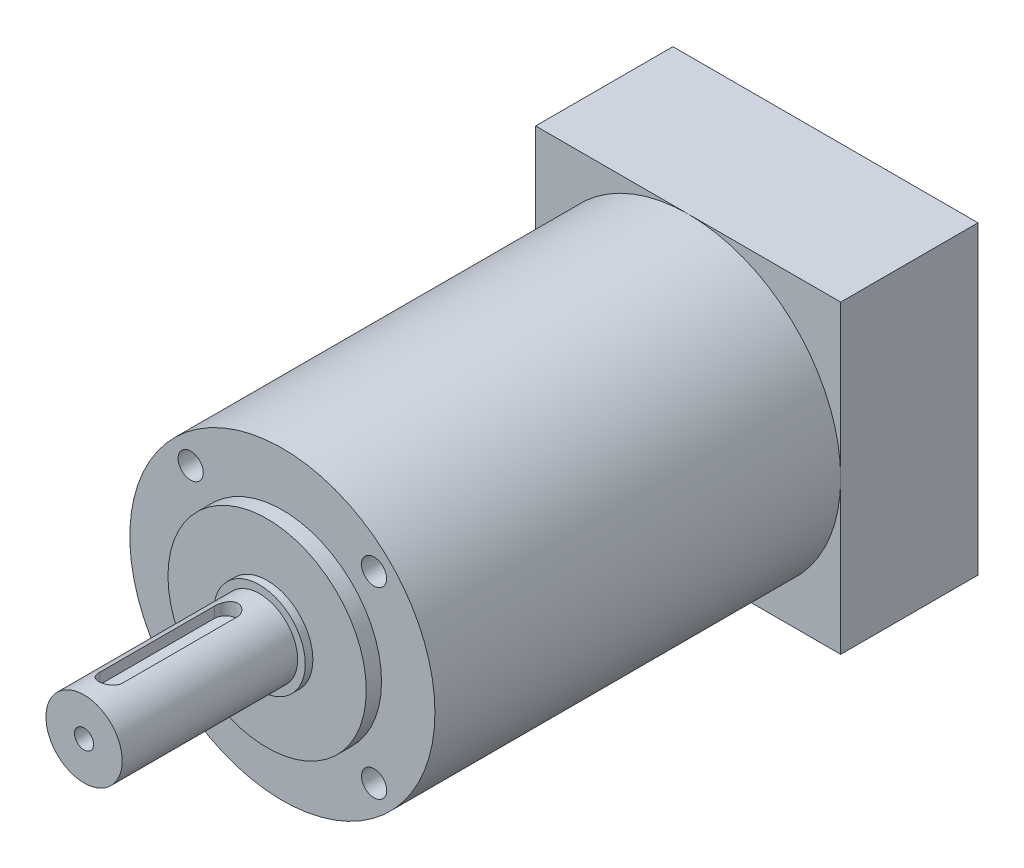
ISO-10303-21;
HEADER;
FILE_DESCRIPTION(('STEP AP214'),'2;1');
FILE_NAME('part.step','',(''),(''),'','','');
FILE_SCHEMA(('AUTOMOTIVE_DESIGN { 1 0 10303 214 1 1 1 1 }'));
ENDSEC;
DATA;
#1=APPLICATION_CONTEXT('core data for automotive mechanical design processes');
#2=APPLICATION_PROTOCOL_DEFINITION('international standard','automotive_design',2000,#1);
#3=PRODUCT_CONTEXT('',#1,'mechanical');
#4=PRODUCT('Part','Part','',(#3));
#5=PRODUCT_RELATED_PRODUCT_CATEGORY('part','',(#4));
#6=PRODUCT_DEFINITION_FORMATION('','',#4);
#7=PRODUCT_DEFINITION_CONTEXT('part definition',#1,'design');
#8=PRODUCT_DEFINITION('design','',#6,#7);
#9=PRODUCT_DEFINITION_SHAPE('','',#8);
#10=(LENGTH_UNIT() NAMED_UNIT(*) SI_UNIT(.MILLI.,.METRE.));
#11=(NAMED_UNIT(*) PLANE_ANGLE_UNIT() SI_UNIT($,.RADIAN.));
#12=(NAMED_UNIT(*) SI_UNIT($,.STERADIAN.) SOLID_ANGLE_UNIT());
#13=UNCERTAINTY_MEASURE_WITH_UNIT(LENGTH_MEASURE(1.E-05),#10,'distance_accuracy_value','');
#14=(GEOMETRIC_REPRESENTATION_CONTEXT(3) GLOBAL_UNCERTAINTY_ASSIGNED_CONTEXT((#13)) GLOBAL_UNIT_ASSIGNED_CONTEXT((#10,
#11,#12)) REPRESENTATION_CONTEXT('',''));
#15=CARTESIAN_POINT('',(0.,0.,0.));
#16=DIRECTION('',(0.,0.,1.));
#17=DIRECTION('',(1.,0.,0.));
#18=AXIS2_PLACEMENT_3D('',#15,#16,#17);
#19=CARTESIAN_POINT('',(20.,20.,97.2));
#20=DIRECTION('',(0.,0.,-1.));
#21=DIRECTION('',(-1.,0.,0.));
#22=AXIS2_PLACEMENT_3D('',#19,#20,#21);
#23=CYLINDRICAL_SURFACE('',#22,5.);
#24=CARTESIAN_POINT('',(20.,20.,97.2));
#25=DIRECTION('',(0.,0.,1.));
#26=DIRECTION('',(1.,0.,0.));
#27=AXIS2_PLACEMENT_3D('',#24,#25,#26);
#28=CIRCLE('',#27,5.);
#29=CARTESIAN_POINT('',(25.,20.,97.2));
#30=VERTEX_POINT('',#29);
#31=EDGE_CURVE('E213',#30,#30,#28,.T.);
#32=ORIENTED_EDGE('',*,*,#31,.F.);
#33=EDGE_LOOP('',(#32));
#34=FACE_BOUND('',#33,.T.);
#35=CARTESIAN_POINT('',(20.,20.,74.2));
#36=DIRECTION('',(0.,0.,1.));
#37=DIRECTION('',(1.,0.,0.));
#38=AXIS2_PLACEMENT_3D('',#35,#36,#37);
#39=CIRCLE('',#38,5.);
#40=CARTESIAN_POINT('',(25.,20.,74.2));
#41=VERTEX_POINT('',#40);
#42=EDGE_CURVE('E218',#41,#41,#39,.T.);
#43=ORIENTED_EDGE('',*,*,#42,.T.);
#44=EDGE_LOOP('',(#43));
#45=FACE_BOUND('',#44,.T.);
#46=CARTESIAN_POINT('',(21.0684550039502,24.884506515968,78.2));
#47=CARTESIAN_POINT('',(21.0684553222245,24.8845032639611,78.1582478311053));
#48=CARTESIAN_POINT('',(21.0667106660423,24.8848884190776,78.1165162471493));
#49=CARTESIAN_POINT('',(21.0597544172261,24.8864035248734,78.0333628801551));
#50=CARTESIAN_POINT('',(21.054543345131,24.8875333637261,77.9919410515464));
#51=CARTESIAN_POINT('',(21.0337800082053,24.8919844015433,77.8687365150896));
#52=CARTESIAN_POINT('',(21.0130973437294,24.8963674442936,77.7877965811134));
#53=CARTESIAN_POINT('',(20.9586904493266,24.907308034786,77.6306393897558));
#54=CARTESIAN_POINT('',(20.9249661897149,24.9138655874777,77.5544221431246));
#55=CARTESIAN_POINT('',(20.8454401305982,24.9281698452386,77.4086724418872));
#56=CARTESIAN_POINT('',(20.7996359141411,24.9359167881507,77.339141328843));
#57=CARTESIAN_POINT('',(20.6964067198537,24.951542785385,77.2076196618036));
#58=CARTESIAN_POINT('',(20.6388179946437,24.9594220808372,77.1457576182941));
#59=CARTESIAN_POINT('',(20.5139842596798,24.9739080234864,77.0324911691048));
#60=CARTESIAN_POINT('',(20.4467385015254,24.9805145719551,76.9810875746807));
#61=CARTESIAN_POINT('',(20.304365543838,24.9912376664897,76.8902017636405));
#62=CARTESIAN_POINT('',(20.2292331499082,24.9953525592417,76.8507274712782));
#63=CARTESIAN_POINT('',(20.0733035993552,25.0000699693571,76.7849797978356));
#64=CARTESIAN_POINT('',(19.9925080454752,25.000673476456,76.7587026988416));
#65=CARTESIAN_POINT('',(19.8301166669596,24.9977535885977,76.7207149410442));
#66=CARTESIAN_POINT('',(19.7486124307313,24.9943496876941,76.7086029301087));
#67=CARTESIAN_POINT('',(19.5850007900716,24.9834220405472,76.6978527080696));
#68=CARTESIAN_POINT('',(19.5028934232576,24.9758985491268,76.6992136636663));
#69=CARTESIAN_POINT('',(19.3414672500338,24.9571019375334,76.7150844319336));
#70=CARTESIAN_POINT('',(19.2621264076574,24.9458769074013,76.7294295234841));
#71=CARTESIAN_POINT('',(19.107229518422,24.9202773538226,76.7704220781391));
#72=CARTESIAN_POINT('',(19.0316740466834,24.9059023535654,76.79707140441));
#73=CARTESIAN_POINT('',(18.8836855229931,24.8743982913341,76.8628881326708));
#74=CARTESIAN_POINT('',(18.8114426687726,24.8571929248875,76.9024460367772));
#75=CARTESIAN_POINT('',(18.6745563281135,24.8216395957381,76.9926601857627));
#76=CARTESIAN_POINT('',(18.6099152832399,24.8032912688155,77.0433199814918));
#77=CARTESIAN_POINT('',(18.4869036099748,24.7660111198753,77.1571249291031));
#78=CARTESIAN_POINT('',(18.4289631921027,24.7470917354394,77.220740392383));
#79=CARTESIAN_POINT('',(18.3245554456413,24.7112568932542,77.3573250380877));
#80=CARTESIAN_POINT('',(18.2780909891476,24.6943419377043,77.43029655513));
#81=CARTESIAN_POINT('',(18.1984002655987,24.6643377823726,77.5832791527532));
#82=CARTESIAN_POINT('',(18.1650930375982,24.6512253217126,77.6632433621914));
#83=CARTESIAN_POINT('',(18.1126811734839,24.6302096484992,77.8282729483284));
#84=CARTESIAN_POINT('',(18.093548108258,24.6222960122972,77.9133277422705));
#85=CARTESIAN_POINT('',(18.0774375006767,24.6156006134936,78.0326719730697));
#86=CARTESIAN_POINT('',(18.0740698425714,24.614195414875,78.0660545850888));
#87=CARTESIAN_POINT('',(18.0695807787905,24.612319066275,78.1329522436719));
#88=CARTESIAN_POINT('',(18.0684564117849,24.6118466849061,78.1664670570449));
#89=CARTESIAN_POINT('',(18.0684550039502,24.6118471275873,78.2));
#90=B_SPLINE_CURVE_WITH_KNOTS('',3,(#46,#47,#48,#49,#50,#51,#52,#53,#54,#55,#56,#57,#58,#59,#60,
#61,#62,#63,#64,#65,#66,#67,#68,#69,#70,#71,#72,#73,#74,#75,#76,#77,#78,#79,#80,#81,#82,#83,#84,
#85,#86,#87,#88,#89),.UNSPECIFIED.,.F.,.F.,(4,2,2,2,2,2,2,2,2,2,2,2,2,2,2,2,2,2,2,2,2,4),(0.,
0.125177748683609,0.25033670413336,0.500008594700727,0.74968105356523,0.999403504727742,
1.25286550335843,1.50634715538985,1.75999681892443,2.01357498412974,2.25977946220798,
2.50596871269161,2.74907783818914,2.99222378852018,3.24353900749491,3.49493472522441,
3.75799712227667,4.02112528955003,4.2826081307942,4.54356508547078,4.64423889157907,
4.7447797117601),.UNSPECIFIED.);
#91=CARTESIAN_POINT('',(21.0684550039502,24.884506515968,78.2));
#92=VERTEX_POINT('',#91);
#93=CARTESIAN_POINT('',(18.0684550039502,24.6118471275873,78.2));
#94=VERTEX_POINT('',#93);
#95=EDGE_CURVE('E222',#92,#94,#90,.T.);
#96=ORIENTED_EDGE('',*,*,#95,.F.);
#97=DIRECTION('',(0.,0.,-1.));
#98=VECTOR('',#97,1.);
#99=CARTESIAN_POINT('',(21.0684550039502,24.884506515968,97.2));
#100=LINE('',#99,#98);
#101=CARTESIAN_POINT('',(21.0684550039502,24.884506515968,93.2));
#102=VERTEX_POINT('',#101);
#103=EDGE_CURVE('E11',#102,#92,#100,.T.);
#104=ORIENTED_EDGE('',*,*,#103,.F.);
#105=CARTESIAN_POINT('',(18.0684550039502,24.6118471275873,93.2));
#106=CARTESIAN_POINT('',(18.0684534594832,24.6118431482032,93.2403591282937));
#107=CARTESIAN_POINT('',(18.0700849395896,24.612530108937,93.280697314133));
#108=CARTESIAN_POINT('',(18.0765815665422,24.6152443243364,93.361054211197));
#109=CARTESIAN_POINT('',(18.0814456687444,24.6172711460158,93.4010730214034));
#110=CARTESIAN_POINT('',(18.1007825900107,24.6252759986282,93.5199208612992));
#111=CARTESIAN_POINT('',(18.1200007010458,24.633179166561,93.5979040211294));
#112=CARTESIAN_POINT('',(18.1703328187786,24.6532827336964,93.7491980219982));
#113=CARTESIAN_POINT('',(18.2014372733809,24.6654796817159,93.8225125597822));
#114=CARTESIAN_POINT('',(18.274532658459,24.6930037462999,93.9629108103451));
#115=CARTESIAN_POINT('',(18.3165320657442,24.7083332982045,94.0299896159686));
#116=CARTESIAN_POINT('',(18.4123960414362,24.7415393542841,94.1593219892124));
#117=CARTESIAN_POINT('',(18.4667122573895,24.7594998269448,94.2212188585453));
#118=CARTESIAN_POINT('',(18.5846379780196,24.7958894676523,94.3352691282307));
#119=CARTESIAN_POINT('',(18.6482499470342,24.8143187589113,94.3874199364867));
#120=CARTESIAN_POINT('',(18.786718243476,24.851115693526,94.4830882258545));
#121=CARTESIAN_POINT('',(18.861977887234,24.8694341311751,94.5260432994823));
#122=CARTESIAN_POINT('',(19.0192471957186,24.9035282065682,94.5985218714184));
#123=CARTESIAN_POINT('',(19.1012558047134,24.9193042408793,94.6280474657841));
#124=CARTESIAN_POINT('',(19.2680541543951,24.9468425813821,94.6720893124167));
#125=CARTESIAN_POINT('',(19.3527544646987,24.9586794105067,94.686896226536));
#126=CARTESIAN_POINT('',(19.5239214406574,24.9780274375608,94.7017954966135));
#127=CARTESIAN_POINT('',(19.6103875257123,24.9855400343522,94.7018926137663));
#128=CARTESIAN_POINT('',(19.7781121579897,24.9957466629887,94.6875421200787));
#129=CARTESIAN_POINT('',(19.8594189340441,24.9986579313181,94.6738039942013));
#130=CARTESIAN_POINT('',(20.0187212795362,25.0005995507854,94.6331837564348));
#131=CARTESIAN_POINT('',(20.0967170701617,24.9996301615812,94.6063025240679));
#132=CARTESIAN_POINT('',(20.2462402017775,24.9944871550031,94.5405958951361));
#133=CARTESIAN_POINT('',(20.3178345706632,24.9903525769383,94.5019194511951));
#134=CARTESIAN_POINT('',(20.4537298444338,24.9798374091161,94.4136132895116));
#135=CARTESIAN_POINT('',(20.518029746589,24.9734565110631,94.3639820686325));
#136=CARTESIAN_POINT('',(20.6393439430936,24.9593421433252,94.2536137675133));
#137=CARTESIAN_POINT('',(20.6961146562754,24.9515768063374,94.1926130140462));
#138=CARTESIAN_POINT('',(20.7988092062853,24.9360519615141,94.0620488584983));
#139=CARTESIAN_POINT('',(20.8447298239267,24.9282924560879,93.992482924446));
#140=CARTESIAN_POINT('',(20.9252599531904,24.9138179409562,93.8451866088268));
#141=CARTESIAN_POINT('',(20.9596295814313,24.907126440308,93.7673227027356));
#142=CARTESIAN_POINT('',(21.0147236973884,24.8960326986387,93.6068003512869));
#143=CARTESIAN_POINT('',(21.0354644557001,24.8916277292062,93.5241477516387));
#144=CARTESIAN_POINT('',(21.055524590364,24.8873207775386,93.4006296853765));
#145=CARTESIAN_POINT('',(21.0603733113313,24.886268917663,93.3606327142293));
#146=CARTESIAN_POINT('',(21.0668357855249,24.8848610821241,93.2804302837452));
#147=CARTESIAN_POINT('',(21.0684546763741,24.8845040013127,93.2402252576762));
#148=CARTESIAN_POINT('',(21.0684550039502,24.884506515968,93.2));
#149=B_SPLINE_CURVE_WITH_KNOTS('',3,(#105,#106,#107,#108,#109,#110,#111,#112,#113,#114,#115,
#116,#117,#118,#119,#120,#121,#122,#123,#124,#125,#126,#127,#128,#129,#130,#131,#132,#133,#134,
#135,#136,#137,#138,#139,#140,#141,#142,#143,#144,#145,#146,#147,#148),.UNSPECIFIED.,.F.,.F.,(4,
2,2,2,2,2,2,2,2,2,2,2,2,2,2,2,2,2,2,2,2,4),(0.,0.120997868857539,0.241956655425474,
0.482800779671874,0.723451762563151,0.964290548308444,1.21604956181508,1.46787543903236,
1.7322992305275,1.99668173689156,2.25573288622469,2.51470018697629,2.76103106796869,
3.00734546702941,3.25066982975113,3.49402760048865,3.74395592082672,3.99395830120239,
4.2488711156325,4.50347905113876,4.62427302281101,4.74487469636064),.UNSPECIFIED.);
#150=CARTESIAN_POINT('',(18.0684550039502,24.6118471275873,93.2));
#151=VERTEX_POINT('',#150);
#152=EDGE_CURVE('E54',#151,#102,#149,.T.);
#153=ORIENTED_EDGE('',*,*,#152,.F.);
#154=DIRECTION('',(0.,0.,-1.));
#155=VECTOR('',#154,1.);
#156=CARTESIAN_POINT('',(18.0684550039502,24.6118471275873,97.2));
#157=LINE('',#156,#155);
#158=EDGE_CURVE('E302',#94,#151,#157,.F.);
#159=ORIENTED_EDGE('',*,*,#158,.F.);
#160=EDGE_LOOP('',(#96,#104,#153,#159));
#161=FACE_BOUND('',#160,.T.);
#162=ADVANCED_FACE('F45',(#34,#45,#161),#23,.T.);
#163=CARTESIAN_POINT('',(0.,0.,18.));
#164=DIRECTION('',(0.,0.,-1.));
#165=DIRECTION('',(-1.,0.,0.));
#166=AXIS2_PLACEMENT_3D('',#163,#164,#165);
#167=PLANE('',#166);
#168=CARTESIAN_POINT('',(20.,20.,18.));
#169=DIRECTION('',(0.,0.,1.));
#170=DIRECTION('',(1.,0.,0.));
#171=AXIS2_PLACEMENT_3D('',#168,#169,#170);
#172=CIRCLE('',#171,20.);
#173=CARTESIAN_POINT('',(40.,20.,18.));
#174=VERTEX_POINT('',#173);
#175=CARTESIAN_POINT('',(20.,40.,18.));
#176=VERTEX_POINT('',#175);
#177=EDGE_CURVE('E235',#174,#176,#172,.T.);
#178=ORIENTED_EDGE('',*,*,#177,.F.);
#179=DIRECTION('',(0.,1.,0.));
#180=VECTOR('',#179,1.);
#181=CARTESIAN_POINT('',(40.,0.,18.));
#182=LINE('',#181,#180);
#183=CARTESIAN_POINT('',(40.,40.,18.));
#184=VERTEX_POINT('',#183);
#185=EDGE_CURVE('E257',#174,#184,#182,.T.);
#186=ORIENTED_EDGE('',*,*,#185,.T.);
#187=DIRECTION('',(-1.,0.,0.));
#188=VECTOR('',#187,1.);
#189=CARTESIAN_POINT('',(0.,40.,18.));
#190=LINE('',#189,#188);
#191=EDGE_CURVE('E262',#184,#176,#190,.T.);
#192=ORIENTED_EDGE('',*,*,#191,.T.);
#193=EDGE_LOOP('',(#178,#186,#192));
#194=FACE_BOUND('',#193,.T.);
#195=ADVANCED_FACE('F347',(#194),#167,.F.);
#196=CARTESIAN_POINT('',(0.,20.,18.));
#197=VERTEX_POINT('',#196);
#198=EDGE_CURVE('E68',#176,#197,#172,.T.);
#199=ORIENTED_EDGE('',*,*,#198,.F.);
#200=CARTESIAN_POINT('',(0.,40.,18.));
#201=VERTEX_POINT('',#200);
#202=EDGE_CURVE('E261',#176,#201,#190,.T.);
#203=ORIENTED_EDGE('',*,*,#202,.T.);
#204=DIRECTION('',(0.,-1.,0.));
#205=VECTOR('',#204,1.);
#206=CARTESIAN_POINT('',(0.,0.,18.));
#207=LINE('',#206,#205);
#208=EDGE_CURVE('E248',#201,#197,#207,.T.);
#209=ORIENTED_EDGE('',*,*,#208,.T.);
#210=EDGE_LOOP('',(#199,#203,#209));
#211=FACE_BOUND('',#210,.T.);
#212=ADVANCED_FACE('F352',(#211),#167,.F.);
#213=CARTESIAN_POINT('',(20.,0.,18.));
#214=VERTEX_POINT('',#213);
#215=EDGE_CURVE('E414',#197,#214,#172,.T.);
#216=ORIENTED_EDGE('',*,*,#215,.F.);
#217=CARTESIAN_POINT('',(0.,0.,18.));
#218=VERTEX_POINT('',#217);
#219=EDGE_CURVE('E252',#197,#218,#207,.T.);
#220=ORIENTED_EDGE('',*,*,#219,.T.);
#221=DIRECTION('',(1.,0.,0.));
#222=VECTOR('',#221,1.);
#223=CARTESIAN_POINT('',(0.,0.,18.));
#224=LINE('',#223,#222);
#225=EDGE_CURVE('E253',#218,#214,#224,.T.);
#226=ORIENTED_EDGE('',*,*,#225,.T.);
#227=EDGE_LOOP('',(#216,#220,#226));
#228=FACE_BOUND('',#227,.T.);
#229=ADVANCED_FACE('F413',(#228),#167,.F.);
#230=CARTESIAN_POINT('',(0.,0.,18.));
#231=DIRECTION('',(1.,0.,0.));
#232=DIRECTION('',(0.,1.,0.));
#233=AXIS2_PLACEMENT_3D('',#230,#231,#232);
#234=PLANE('',#233);
#235=DIRECTION('',(0.,-1.,0.));
#236=VECTOR('',#235,1.);
#237=CARTESIAN_POINT('',(0.,0.,0.));
#238=LINE('',#237,#236);
#239=CARTESIAN_POINT('',(0.,40.,0.));
#240=VERTEX_POINT('',#239);
#241=CARTESIAN_POINT('',(0.,0.,0.));
#242=VERTEX_POINT('',#241);
#243=EDGE_CURVE('E243',#240,#242,#238,.T.);
#244=ORIENTED_EDGE('',*,*,#243,.T.);
#245=DIRECTION('',(0.,0.,-1.));
#246=VECTOR('',#245,1.);
#247=CARTESIAN_POINT('',(0.,0.,18.));
#248=LINE('',#247,#246);
#249=EDGE_CURVE('E290',#218,#242,#248,.T.);
#250=ORIENTED_EDGE('',*,*,#249,.F.);
#251=ORIENTED_EDGE('',*,*,#219,.F.);
#252=ORIENTED_EDGE('',*,*,#208,.F.);
#253=DIRECTION('',(0.,0.,-1.));
#254=VECTOR('',#253,1.);
#255=CARTESIAN_POINT('',(0.,40.,18.));
#256=LINE('',#255,#254);
#257=EDGE_CURVE('E266',#201,#240,#256,.T.);
#258=ORIENTED_EDGE('',*,*,#257,.T.);
#259=EDGE_LOOP('',(#244,#250,#251,#252,#258));
#260=FACE_BOUND('',#259,.T.);
#261=ADVANCED_FACE('F47',(#260),#234,.F.);
#262=CARTESIAN_POINT('',(0.,0.,18.));
#263=DIRECTION('',(0.,1.,0.));
#264=DIRECTION('',(0.,0.,1.));
#265=AXIS2_PLACEMENT_3D('',#262,#263,#264);
#266=PLANE('',#265);
#267=DIRECTION('',(1.,0.,0.));
#268=VECTOR('',#267,1.);
#269=CARTESIAN_POINT('',(0.,0.,0.));
#270=LINE('',#269,#268);
#271=CARTESIAN_POINT('',(40.,0.,0.));
#272=VERTEX_POINT('',#271);
#273=EDGE_CURVE('E270',#242,#272,#270,.T.);
#274=ORIENTED_EDGE('',*,*,#273,.T.);
#275=DIRECTION('',(0.,0.,-1.));
#276=VECTOR('',#275,1.);
#277=CARTESIAN_POINT('',(40.,0.,18.));
#278=LINE('',#277,#276);
#279=CARTESIAN_POINT('',(40.,0.,18.));
#280=VERTEX_POINT('',#279);
#281=EDGE_CURVE('E286',#280,#272,#278,.T.);
#282=ORIENTED_EDGE('',*,*,#281,.F.);
#283=EDGE_CURVE('E251',#214,#280,#224,.T.);
#284=ORIENTED_EDGE('',*,*,#283,.F.);
#285=ORIENTED_EDGE('',*,*,#225,.F.);
#286=ORIENTED_EDGE('',*,*,#249,.T.);
#287=EDGE_LOOP('',(#274,#282,#284,#285,#286));
#288=FACE_BOUND('',#287,.T.);
#289=ADVANCED_FACE('F419',(#288),#266,.F.);
#290=CARTESIAN_POINT('',(40.,0.,18.));
#291=DIRECTION('',(-1.,0.,0.));
#292=DIRECTION('',(0.,-1.,0.));
#293=AXIS2_PLACEMENT_3D('',#290,#291,#292);
#294=PLANE('',#293);
#295=DIRECTION('',(0.,1.,0.));
#296=VECTOR('',#295,1.);
#297=CARTESIAN_POINT('',(40.,0.,0.));
#298=LINE('',#297,#296);
#299=CARTESIAN_POINT('',(40.,40.,0.));
#300=VERTEX_POINT('',#299);
#301=EDGE_CURVE('E273',#272,#300,#298,.T.);
#302=ORIENTED_EDGE('',*,*,#301,.T.);
#303=DIRECTION('',(0.,0.,-1.));
#304=VECTOR('',#303,1.);
#305=CARTESIAN_POINT('',(40.,40.,18.));
#306=LINE('',#305,#304);
#307=EDGE_CURVE('E282',#184,#300,#306,.T.);
#308=ORIENTED_EDGE('',*,*,#307,.F.);
#309=ORIENTED_EDGE('',*,*,#185,.F.);
#310=EDGE_CURVE('E258',#280,#174,#182,.T.);
#311=ORIENTED_EDGE('',*,*,#310,.F.);
#312=ORIENTED_EDGE('',*,*,#281,.T.);
#313=EDGE_LOOP('',(#302,#308,#309,#311,#312));
#314=FACE_BOUND('',#313,.T.);
#315=ADVANCED_FACE('F426',(#314),#294,.F.);
#316=CARTESIAN_POINT('',(0.,40.,18.));
#317=DIRECTION('',(0.,-1.,0.));
#318=DIRECTION('',(0.,0.,-1.));
#319=AXIS2_PLACEMENT_3D('',#316,#317,#318);
#320=PLANE('',#319);
#321=DIRECTION('',(-1.,0.,0.));
#322=VECTOR('',#321,1.);
#323=CARTESIAN_POINT('',(0.,40.,0.));
#324=LINE('',#323,#322);
#325=EDGE_CURVE('E276',#300,#240,#324,.T.);
#326=ORIENTED_EDGE('',*,*,#325,.T.);
#327=ORIENTED_EDGE('',*,*,#257,.F.);
#328=ORIENTED_EDGE('',*,*,#202,.F.);
#329=ORIENTED_EDGE('',*,*,#191,.F.);
#330=ORIENTED_EDGE('',*,*,#307,.T.);
#331=EDGE_LOOP('',(#326,#327,#328,#329,#330));
#332=FACE_BOUND('',#331,.T.);
#333=ADVANCED_FACE('F402',(#332),#320,.F.);
#334=EDGE_CURVE('E247',#214,#174,#172,.T.);
#335=ORIENTED_EDGE('',*,*,#334,.F.);
#336=ORIENTED_EDGE('',*,*,#283,.T.);
#337=ORIENTED_EDGE('',*,*,#310,.T.);
#338=EDGE_LOOP('',(#335,#336,#337));
#339=FACE_BOUND('',#338,.T.);
#340=ADVANCED_FACE('F355',(#339),#167,.F.);
#341=CARTESIAN_POINT('',(0.,0.,0.));
#342=DIRECTION('',(0.,0.,-1.));
#343=DIRECTION('',(-1.,0.,0.));
#344=AXIS2_PLACEMENT_3D('',#341,#342,#343);
#345=PLANE('',#344);
#346=ORIENTED_EDGE('',*,*,#243,.F.);
#347=ORIENTED_EDGE('',*,*,#325,.F.);
#348=ORIENTED_EDGE('',*,*,#301,.F.);
#349=ORIENTED_EDGE('',*,*,#273,.F.);
#350=EDGE_LOOP('',(#346,#347,#348,#349));
#351=FACE_BOUND('',#350,.T.);
#352=ADVANCED_FACE('F393',(#351),#345,.T.);
#353=CARTESIAN_POINT('',(20.,20.,71.2));
#354=DIRECTION('',(0.,0.,-1.));
#355=DIRECTION('',(-1.,0.,0.));
#356=AXIS2_PLACEMENT_3D('',#353,#354,#355);
#357=CYLINDRICAL_SURFACE('',#356,20.);
#358=CARTESIAN_POINT('',(20.,20.,71.2));
#359=DIRECTION('',(0.,0.,1.));
#360=DIRECTION('',(1.,0.,0.));
#361=AXIS2_PLACEMENT_3D('',#358,#359,#360);
#362=CIRCLE('',#361,20.);
#363=CARTESIAN_POINT('',(40.,20.,71.2));
#364=VERTEX_POINT('',#363);
#365=EDGE_CURVE('E239',#364,#364,#362,.T.);
#366=ORIENTED_EDGE('',*,*,#365,.F.);
#367=EDGE_LOOP('',(#366));
#368=FACE_BOUND('',#367,.T.);
#369=ORIENTED_EDGE('',*,*,#177,.T.);
#370=ORIENTED_EDGE('',*,*,#198,.T.);
#371=ORIENTED_EDGE('',*,*,#215,.T.);
#372=ORIENTED_EDGE('',*,*,#334,.T.);
#373=EDGE_LOOP('',(#369,#370,#371,#372));
#374=FACE_BOUND('',#373,.T.);
#375=ADVANCED_FACE('F386',(#368,#374),#357,.T.);
#376=CARTESIAN_POINT('',(20.,20.,71.2));
#377=DIRECTION('',(0.,0.,1.));
#378=DIRECTION('',(1.,0.,0.));
#379=AXIS2_PLACEMENT_3D('',#376,#377,#378);
#380=PLANE('',#379);
#381=CARTESIAN_POINT('',(7.97918471982879,7.97918471982858,71.2));
#382=DIRECTION('',(0.,0.,1.));
#383=DIRECTION('',(0.,1.,0.));
#384=AXIS2_PLACEMENT_3D('',#381,#382,#383);
#385=CIRCLE('',#384,1.65);
#386=CARTESIAN_POINT('',(7.97918471982879,9.62918471982858,71.2));
#387=VERTEX_POINT('',#386);
#388=EDGE_CURVE('E149',#387,#387,#385,.T.);
#389=ORIENTED_EDGE('',*,*,#388,.F.);
#390=EDGE_LOOP('',(#389));
#391=FACE_BOUND('',#390,.T.);
#392=CARTESIAN_POINT('',(32.0208152801714,7.97918471982876,71.2));
#393=DIRECTION('',(0.,0.,1.));
#394=DIRECTION('',(-1.,0.,0.));
#395=AXIS2_PLACEMENT_3D('',#392,#393,#394);
#396=CIRCLE('',#395,1.65);
#397=CARTESIAN_POINT('',(30.3708152801714,7.97918471982876,71.2));
#398=VERTEX_POINT('',#397);
#399=EDGE_CURVE('E160',#398,#398,#396,.T.);
#400=ORIENTED_EDGE('',*,*,#399,.F.);
#401=EDGE_LOOP('',(#400));
#402=FACE_BOUND('',#401,.T.);
#403=CARTESIAN_POINT('',(32.0208152801711,32.0208152801715,71.2));
#404=DIRECTION('',(0.,0.,1.));
#405=DIRECTION('',(0.,-1.,0.));
#406=AXIS2_PLACEMENT_3D('',#403,#404,#405);
#407=CIRCLE('',#406,1.65);
#408=CARTESIAN_POINT('',(32.0208152801711,30.3708152801715,71.2));
#409=VERTEX_POINT('',#408);
#410=EDGE_CURVE('E168',#409,#409,#407,.T.);
#411=ORIENTED_EDGE('',*,*,#410,.F.);
#412=EDGE_LOOP('',(#411));
#413=FACE_BOUND('',#412,.T.);
#414=CARTESIAN_POINT('',(7.97918471982862,32.0208152801712,71.2));
#415=DIRECTION('',(0.,0.,1.));
#416=DIRECTION('',(1.,0.,0.));
#417=AXIS2_PLACEMENT_3D('',#414,#415,#416);
#418=CIRCLE('',#417,1.65);
#419=CARTESIAN_POINT('',(9.62918471982862,32.0208152801712,71.2));
#420=VERTEX_POINT('',#419);
#421=EDGE_CURVE('E148',#420,#420,#418,.T.);
#422=ORIENTED_EDGE('',*,*,#421,.F.);
#423=EDGE_LOOP('',(#422));
#424=FACE_BOUND('',#423,.T.);
#425=CARTESIAN_POINT('',(20.,20.,71.2));
#426=DIRECTION('',(0.,0.,1.));
#427=DIRECTION('',(1.,0.,0.));
#428=AXIS2_PLACEMENT_3D('',#425,#426,#427);
#429=CIRCLE('',#428,13.);
#430=CARTESIAN_POINT('',(33.,20.,71.2));
#431=VERTEX_POINT('',#430);
#432=EDGE_CURVE('E231',#431,#431,#429,.T.);
#433=ORIENTED_EDGE('',*,*,#432,.F.);
#434=EDGE_LOOP('',(#433));
#435=FACE_BOUND('',#434,.T.);
#436=ORIENTED_EDGE('',*,*,#365,.T.);
#437=EDGE_LOOP('',(#436));
#438=FACE_BOUND('',#437,.T.);
#439=ADVANCED_FACE('F380',(#391,#402,#413,#424,#435,#438),#380,.T.);
#440=CARTESIAN_POINT('',(20.,20.,73.2));
#441=DIRECTION('',(0.,0.,-1.));
#442=DIRECTION('',(-1.,0.,0.));
#443=AXIS2_PLACEMENT_3D('',#440,#441,#442);
#444=CYLINDRICAL_SURFACE('',#443,13.);
#445=CARTESIAN_POINT('',(20.,20.,73.2));
#446=DIRECTION('',(0.,0.,1.));
#447=DIRECTION('',(1.,0.,0.));
#448=AXIS2_PLACEMENT_3D('',#445,#446,#447);
#449=CIRCLE('',#448,13.);
#450=CARTESIAN_POINT('',(33.,20.,73.2));
#451=VERTEX_POINT('',#450);
#452=EDGE_CURVE('E227',#451,#451,#449,.T.);
#453=ORIENTED_EDGE('',*,*,#452,.F.);
#454=EDGE_LOOP('',(#453));
#455=FACE_BOUND('',#454,.T.);
#456=ORIENTED_EDGE('',*,*,#432,.T.);
#457=EDGE_LOOP('',(#456));
#458=FACE_BOUND('',#457,.T.);
#459=ADVANCED_FACE('F374',(#455,#458),#444,.T.);
#460=CARTESIAN_POINT('',(20.,20.,73.2));
#461=DIRECTION('',(0.,0.,1.));
#462=DIRECTION('',(1.,0.,0.));
#463=AXIS2_PLACEMENT_3D('',#460,#461,#462);
#464=PLANE('',#463);
#465=CARTESIAN_POINT('',(20.,20.,73.2));
#466=DIRECTION('',(0.,0.,1.));
#467=DIRECTION('',(1.,0.,0.));
#468=AXIS2_PLACEMENT_3D('',#465,#466,#467);
#469=CIRCLE('',#468,6.);
#470=CARTESIAN_POINT('',(26.,20.,73.2));
#471=VERTEX_POINT('',#470);
#472=EDGE_CURVE('E223',#471,#471,#469,.T.);
#473=ORIENTED_EDGE('',*,*,#472,.F.);
#474=EDGE_LOOP('',(#473));
#475=FACE_BOUND('',#474,.T.);
#476=ORIENTED_EDGE('',*,*,#452,.T.);
#477=EDGE_LOOP('',(#476));
#478=FACE_BOUND('',#477,.T.);
#479=ADVANCED_FACE('F368',(#475,#478),#464,.T.);
#480=CARTESIAN_POINT('',(20.,20.,74.2));
#481=DIRECTION('',(0.,0.,-1.));
#482=DIRECTION('',(-1.,0.,0.));
#483=AXIS2_PLACEMENT_3D('',#480,#481,#482);
#484=CYLINDRICAL_SURFACE('',#483,6.);
#485=CARTESIAN_POINT('',(20.,20.,74.2));
#486=DIRECTION('',(0.,0.,1.));
#487=DIRECTION('',(1.,0.,0.));
#488=AXIS2_PLACEMENT_3D('',#485,#486,#487);
#489=CIRCLE('',#488,6.);
#490=CARTESIAN_POINT('',(26.,20.,74.2));
#491=VERTEX_POINT('',#490);
#492=EDGE_CURVE('E217',#491,#491,#489,.T.);
#493=ORIENTED_EDGE('',*,*,#492,.F.);
#494=EDGE_LOOP('',(#493));
#495=FACE_BOUND('',#494,.T.);
#496=ORIENTED_EDGE('',*,*,#472,.T.);
#497=EDGE_LOOP('',(#496));
#498=FACE_BOUND('',#497,.T.);
#499=ADVANCED_FACE('F363',(#495,#498),#484,.T.);
#500=CARTESIAN_POINT('',(20.,20.,74.2));
#501=DIRECTION('',(0.,0.,1.));
#502=DIRECTION('',(1.,0.,0.));
#503=AXIS2_PLACEMENT_3D('',#500,#501,#502);
#504=PLANE('',#503);
#505=ORIENTED_EDGE('',*,*,#42,.F.);
#506=EDGE_LOOP('',(#505));
#507=FACE_BOUND('',#506,.T.);
#508=ORIENTED_EDGE('',*,*,#492,.T.);
#509=EDGE_LOOP('',(#508));
#510=FACE_BOUND('',#509,.T.);
#511=ADVANCED_FACE('F360',(#507,#510),#504,.T.);
#512=CARTESIAN_POINT('',(20.,20.,97.2));
#513=DIRECTION('',(0.,0.,1.));
#514=DIRECTION('',(1.,0.,0.));
#515=AXIS2_PLACEMENT_3D('',#512,#513,#514);
#516=PLANE('',#515);
#517=CARTESIAN_POINT('',(20.,20.,97.2));
#518=DIRECTION('',(0.,0.,1.));
#519=DIRECTION('',(1.,0.,0.));
#520=AXIS2_PLACEMENT_3D('',#517,#518,#519);
#521=CIRCLE('',#520,1.24999999999999);
#522=CARTESIAN_POINT('',(21.25,20.,97.2));
#523=VERTEX_POINT('',#522);
#524=EDGE_CURVE('E178',#523,#523,#521,.T.);
#525=ORIENTED_EDGE('',*,*,#524,.F.);
#526=EDGE_LOOP('',(#525));
#527=FACE_BOUND('',#526,.T.);
#528=ORIENTED_EDGE('',*,*,#31,.T.);
#529=EDGE_LOOP('',(#528));
#530=FACE_BOUND('',#529,.T.);
#531=ADVANCED_FACE('F321',(#527,#530),#516,.T.);
#532=CARTESIAN_POINT('',(19.5684550039502,23.2,93.2));
#533=DIRECTION('',(0.,1.,0.));
#534=DIRECTION('',(0.,0.,1.));
#535=AXIS2_PLACEMENT_3D('',#532,#533,#534);
#536=CYLINDRICAL_SURFACE('',#535,1.5);
#537=DIRECTION('',(0.,1.,0.));
#538=VECTOR('',#537,1.);
#539=CARTESIAN_POINT('',(18.0684550039502,23.2,93.2));
#540=LINE('',#539,#538);
#541=CARTESIAN_POINT('',(18.0684550039502,23.2,93.2));
#542=VERTEX_POINT('',#541);
#543=EDGE_CURVE('E209',#542,#151,#540,.T.);
#544=ORIENTED_EDGE('',*,*,#543,.T.);
#545=ORIENTED_EDGE('',*,*,#152,.T.);
#546=DIRECTION('',(0.,1.,0.));
#547=VECTOR('',#546,1.);
#548=CARTESIAN_POINT('',(21.0684550039502,23.2,93.2));
#549=LINE('',#548,#547);
#550=CARTESIAN_POINT('',(21.0684550039502,23.2,93.2));
#551=VERTEX_POINT('',#550);
#552=EDGE_CURVE('E60',#551,#102,#549,.T.);
#553=ORIENTED_EDGE('',*,*,#552,.F.);
#554=CARTESIAN_POINT('',(19.5684550039502,23.2,93.2));
#555=DIRECTION('',(0.,-1.,0.));
#556=DIRECTION('',(0.,0.,-1.));
#557=AXIS2_PLACEMENT_3D('',#554,#555,#556);
#558=CIRCLE('',#557,1.5);
#559=EDGE_CURVE('E186',#551,#542,#558,.T.);
#560=ORIENTED_EDGE('',*,*,#559,.T.);
#561=EDGE_LOOP('',(#544,#545,#553,#560));
#562=FACE_BOUND('',#561,.T.);
#563=ADVANCED_FACE('F317',(#562),#536,.F.);
#564=CARTESIAN_POINT('',(18.0684550039502,23.2,93.2));
#565=DIRECTION('',(1.,0.,0.));
#566=DIRECTION('',(0.,0.,-1.));
#567=AXIS2_PLACEMENT_3D('',#564,#565,#566);
#568=PLANE('',#567);
#569=ORIENTED_EDGE('',*,*,#158,.T.);
#570=ORIENTED_EDGE('',*,*,#543,.F.);
#571=DIRECTION('',(0.,0.,-1.));
#572=VECTOR('',#571,1.);
#573=CARTESIAN_POINT('',(18.0684550039502,23.2,93.2));
#574=LINE('',#573,#572);
#575=CARTESIAN_POINT('',(18.0684550039502,23.2,78.2));
#576=VERTEX_POINT('',#575);
#577=EDGE_CURVE('E190',#542,#576,#574,.T.);
#578=ORIENTED_EDGE('',*,*,#577,.T.);
#579=DIRECTION('',(0.,1.,0.));
#580=VECTOR('',#579,1.);
#581=CARTESIAN_POINT('',(18.0684550039502,23.2,78.2));
#582=LINE('',#581,#580);
#583=EDGE_CURVE('E205',#576,#94,#582,.T.);
#584=ORIENTED_EDGE('',*,*,#583,.T.);
#585=EDGE_LOOP('',(#569,#570,#578,#584));
#586=FACE_BOUND('',#585,.T.);
#587=ADVANCED_FACE('F312',(#586),#568,.T.);
#588=CARTESIAN_POINT('',(19.5684550039502,23.2,78.2));
#589=DIRECTION('',(0.,1.,0.));
#590=DIRECTION('',(0.,0.,1.));
#591=AXIS2_PLACEMENT_3D('',#588,#589,#590);
#592=CYLINDRICAL_SURFACE('',#591,1.5);
#593=DIRECTION('',(0.,1.,0.));
#594=VECTOR('',#593,1.);
#595=CARTESIAN_POINT('',(21.0684550039502,23.2,78.2));
#596=LINE('',#595,#594);
#597=CARTESIAN_POINT('',(21.0684550039502,23.2,78.2));
#598=VERTEX_POINT('',#597);
#599=EDGE_CURVE('E201',#598,#92,#596,.T.);
#600=ORIENTED_EDGE('',*,*,#599,.T.);
#601=ORIENTED_EDGE('',*,*,#95,.T.);
#602=ORIENTED_EDGE('',*,*,#583,.F.);
#603=CARTESIAN_POINT('',(19.5684550039502,23.2,78.2));
#604=DIRECTION('',(0.,-1.,0.));
#605=DIRECTION('',(0.,0.,-1.));
#606=AXIS2_PLACEMENT_3D('',#603,#604,#605);
#607=CIRCLE('',#606,1.5);
#608=EDGE_CURVE('E193',#576,#598,#607,.T.);
#609=ORIENTED_EDGE('',*,*,#608,.T.);
#610=EDGE_LOOP('',(#600,#601,#602,#609));
#611=FACE_BOUND('',#610,.T.);
#612=ADVANCED_FACE('F306',(#611),#592,.F.);
#613=CARTESIAN_POINT('',(21.0684550039502,23.2,93.2));
#614=DIRECTION('',(-1.,0.,0.));
#615=DIRECTION('',(0.,0.,1.));
#616=AXIS2_PLACEMENT_3D('',#613,#614,#615);
#617=PLANE('',#616);
#618=ORIENTED_EDGE('',*,*,#103,.T.);
#619=ORIENTED_EDGE('',*,*,#599,.F.);
#620=DIRECTION('',(0.,0.,1.));
#621=VECTOR('',#620,1.);
#622=CARTESIAN_POINT('',(21.0684550039502,23.2,93.2));
#623=LINE('',#622,#621);
#624=EDGE_CURVE('E196',#598,#551,#623,.T.);
#625=ORIENTED_EDGE('',*,*,#624,.T.);
#626=ORIENTED_EDGE('',*,*,#552,.T.);
#627=EDGE_LOOP('',(#618,#619,#625,#626));
#628=FACE_BOUND('',#627,.T.);
#629=ADVANCED_FACE('F311',(#628),#617,.T.);
#630=CARTESIAN_POINT('',(19.5684550039502,23.2,93.2));
#631=DIRECTION('',(0.,-1.,0.));
#632=DIRECTION('',(0.,0.,-1.));
#633=AXIS2_PLACEMENT_3D('',#630,#631,#632);
#634=PLANE('',#633);
#635=ORIENTED_EDGE('',*,*,#559,.F.);
#636=ORIENTED_EDGE('',*,*,#624,.F.);
#637=ORIENTED_EDGE('',*,*,#608,.F.);
#638=ORIENTED_EDGE('',*,*,#577,.F.);
#639=EDGE_LOOP('',(#635,#636,#637,#638));
#640=FACE_BOUND('',#639,.T.);
#641=ADVANCED_FACE('F338',(#640),#634,.F.);
#642=CARTESIAN_POINT('',(20.,20.,82.2));
#643=DIRECTION('',(0.,0.,1.));
#644=DIRECTION('',(1.,0.,0.));
#645=AXIS2_PLACEMENT_3D('',#642,#643,#644);
#646=CONICAL_SURFACE('',#645,1.25,1.02974425867665);
#647=CARTESIAN_POINT('',(20.,20.,81.4489242262156));
#648=VERTEX_POINT('',#647);
#649=VERTEX_LOOP('',#648);
#650=FACE_BOUND('',#649,.T.);
#651=CARTESIAN_POINT('',(20.,20.,82.2));
#652=DIRECTION('',(0.,0.,1.));
#653=DIRECTION('',(1.,0.,0.));
#654=AXIS2_PLACEMENT_3D('',#651,#652,#653);
#655=CIRCLE('',#654,1.25);
#656=CARTESIAN_POINT('',(21.25,20.,82.2));
#657=VERTEX_POINT('',#656);
#658=EDGE_CURVE('E182',#657,#657,#655,.T.);
#659=ORIENTED_EDGE('',*,*,#658,.T.);
#660=EDGE_LOOP('',(#659));
#661=FACE_BOUND('',#660,.T.);
#662=ADVANCED_FACE('F345',(#650,#661),#646,.F.);
#663=CARTESIAN_POINT('',(20.,20.,97.2));
#664=DIRECTION('',(0.,0.,1.));
#665=DIRECTION('',(1.,0.,0.));
#666=AXIS2_PLACEMENT_3D('',#663,#664,#665);
#667=CYLINDRICAL_SURFACE('',#666,1.24999999999999);
#668=ORIENTED_EDGE('',*,*,#658,.F.);
#669=EDGE_LOOP('',(#668));
#670=FACE_BOUND('',#669,.T.);
#671=ORIENTED_EDGE('',*,*,#524,.T.);
#672=EDGE_LOOP('',(#671));
#673=FACE_BOUND('',#672,.T.);
#674=ADVANCED_FACE('F527',(#670,#673),#667,.F.);
#675=CARTESIAN_POINT('',(7.97918471982862,32.0208152801712,64.2));
#676=DIRECTION('',(0.,0.,1.));
#677=DIRECTION('',(1.,0.,0.));
#678=AXIS2_PLACEMENT_3D('',#675,#676,#677);
#679=CONICAL_SURFACE('',#678,1.65,1.02974425867665);
#680=CARTESIAN_POINT('',(7.97918471982862,32.0208152801712,63.2085799786045));
#681=VERTEX_POINT('',#680);
#682=VERTEX_LOOP('',#681);
#683=FACE_BOUND('',#682,.T.);
#684=CARTESIAN_POINT('',(7.97918471982862,32.0208152801712,64.2));
#685=DIRECTION('',(0.,0.,1.));
#686=DIRECTION('',(1.,0.,0.));
#687=AXIS2_PLACEMENT_3D('',#684,#685,#686);
#688=CIRCLE('',#687,1.65);
#689=CARTESIAN_POINT('',(9.62918471982862,32.0208152801712,64.2));
#690=VERTEX_POINT('',#689);
#691=EDGE_CURVE('E154',#690,#690,#688,.T.);
#692=ORIENTED_EDGE('',*,*,#691,.T.);
#693=EDGE_LOOP('',(#692));
#694=FACE_BOUND('',#693,.T.);
#695=ADVANCED_FACE('F538',(#683,#694),#679,.F.);
#696=CARTESIAN_POINT('',(7.97918471982862,32.0208152801712,71.2));
#697=DIRECTION('',(0.,0.,1.));
#698=DIRECTION('',(1.,0.,0.));
#699=AXIS2_PLACEMENT_3D('',#696,#697,#698);
#700=CYLINDRICAL_SURFACE('',#699,1.65);
#701=ORIENTED_EDGE('',*,*,#691,.F.);
#702=EDGE_LOOP('',(#701));
#703=FACE_BOUND('',#702,.T.);
#704=ORIENTED_EDGE('',*,*,#421,.T.);
#705=EDGE_LOOP('',(#704));
#706=FACE_BOUND('',#705,.T.);
#707=ADVANCED_FACE('F551',(#703,#706),#700,.F.);
#708=CARTESIAN_POINT('',(32.0208152801711,32.0208152801715,64.2));
#709=DIRECTION('',(0.,0.,1.));
#710=DIRECTION('',(0.,-1.,0.));
#711=AXIS2_PLACEMENT_3D('',#708,#709,#710);
#712=CONICAL_SURFACE('',#711,1.65,1.02974425867665);
#713=CARTESIAN_POINT('',(32.0208152801711,32.0208152801715,63.2085799786045));
#714=VERTEX_POINT('',#713);
#715=VERTEX_LOOP('',#714);
#716=FACE_BOUND('',#715,.T.);
#717=CARTESIAN_POINT('',(32.0208152801711,32.0208152801715,64.2));
#718=DIRECTION('',(0.,0.,1.));
#719=DIRECTION('',(0.,-1.,0.));
#720=AXIS2_PLACEMENT_3D('',#717,#718,#719);
#721=CIRCLE('',#720,1.65);
#722=CARTESIAN_POINT('',(32.0208152801711,30.3708152801715,64.2));
#723=VERTEX_POINT('',#722);
#724=EDGE_CURVE('E164',#723,#723,#721,.T.);
#725=ORIENTED_EDGE('',*,*,#724,.T.);
#726=EDGE_LOOP('',(#725));
#727=FACE_BOUND('',#726,.T.);
#728=ADVANCED_FACE('F561',(#716,#727),#712,.F.);
#729=CARTESIAN_POINT('',(32.0208152801711,32.0208152801715,71.2));
#730=DIRECTION('',(0.,0.,1.));
#731=DIRECTION('',(0.,-1.,0.));
#732=AXIS2_PLACEMENT_3D('',#729,#730,#731);
#733=CYLINDRICAL_SURFACE('',#732,1.65);
#734=ORIENTED_EDGE('',*,*,#724,.F.);
#735=EDGE_LOOP('',(#734));
#736=FACE_BOUND('',#735,.T.);
#737=ORIENTED_EDGE('',*,*,#410,.T.);
#738=EDGE_LOOP('',(#737));
#739=FACE_BOUND('',#738,.T.);
#740=ADVANCED_FACE('F582',(#736,#739),#733,.F.);
#741=CARTESIAN_POINT('',(32.0208152801714,7.97918471982876,64.2));
#742=DIRECTION('',(0.,0.,1.));
#743=DIRECTION('',(-1.,0.,0.));
#744=AXIS2_PLACEMENT_3D('',#741,#742,#743);
#745=CONICAL_SURFACE('',#744,1.65,1.02974425867665);
#746=CARTESIAN_POINT('',(32.0208152801714,7.97918471982876,63.2085799786045));
#747=VERTEX_POINT('',#746);
#748=VERTEX_LOOP('',#747);
#749=FACE_BOUND('',#748,.T.);
#750=CARTESIAN_POINT('',(32.0208152801714,7.97918471982876,64.2));
#751=DIRECTION('',(0.,0.,1.));
#752=DIRECTION('',(-1.,0.,0.));
#753=AXIS2_PLACEMENT_3D('',#750,#751,#752);
#754=CIRCLE('',#753,1.65);
#755=CARTESIAN_POINT('',(30.3708152801714,7.97918471982876,64.2));
#756=VERTEX_POINT('',#755);
#757=EDGE_CURVE('E157',#756,#756,#754,.T.);
#758=ORIENTED_EDGE('',*,*,#757,.T.);
#759=EDGE_LOOP('',(#758));
#760=FACE_BOUND('',#759,.T.);
#761=ADVANCED_FACE('F593',(#749,#760),#745,.F.);
#762=CARTESIAN_POINT('',(32.0208152801714,7.97918471982876,71.2));
#763=DIRECTION('',(0.,0.,1.));
#764=DIRECTION('',(-1.,0.,0.));
#765=AXIS2_PLACEMENT_3D('',#762,#763,#764);
#766=CYLINDRICAL_SURFACE('',#765,1.65);
#767=ORIENTED_EDGE('',*,*,#757,.F.);
#768=EDGE_LOOP('',(#767));
#769=FACE_BOUND('',#768,.T.);
#770=ORIENTED_EDGE('',*,*,#399,.T.);
#771=EDGE_LOOP('',(#770));
#772=FACE_BOUND('',#771,.T.);
#773=ADVANCED_FACE('F141',(#769,#772),#766,.F.);
#774=CARTESIAN_POINT('',(7.97918471982879,7.97918471982858,64.2));
#775=DIRECTION('',(0.,0.,1.));
#776=DIRECTION('',(0.,1.,0.));
#777=AXIS2_PLACEMENT_3D('',#774,#775,#776);
#778=CONICAL_SURFACE('',#777,1.65,1.02974425867665);
#779=CARTESIAN_POINT('',(7.97918471982879,7.97918471982858,63.2085799786045));
#780=VERTEX_POINT('',#779);
#781=VERTEX_LOOP('',#780);
#782=FACE_BOUND('',#781,.T.);
#783=CARTESIAN_POINT('',(7.97918471982879,7.97918471982858,64.2));
#784=DIRECTION('',(0.,0.,1.));
#785=DIRECTION('',(0.,1.,0.));
#786=AXIS2_PLACEMENT_3D('',#783,#784,#785);
#787=CIRCLE('',#786,1.65);
#788=CARTESIAN_POINT('',(7.97918471982879,9.62918471982858,64.2));
#789=VERTEX_POINT('',#788);
#790=EDGE_CURVE('E145',#789,#789,#787,.T.);
#791=ORIENTED_EDGE('',*,*,#790,.T.);
#792=EDGE_LOOP('',(#791));
#793=FACE_BOUND('',#792,.T.);
#794=ADVANCED_FACE('F137',(#782,#793),#778,.F.);
#795=CARTESIAN_POINT('',(7.97918471982879,7.97918471982858,71.2));
#796=DIRECTION('',(0.,0.,1.));
#797=DIRECTION('',(0.,1.,0.));
#798=AXIS2_PLACEMENT_3D('',#795,#796,#797);
#799=CYLINDRICAL_SURFACE('',#798,1.65);
#800=ORIENTED_EDGE('',*,*,#790,.F.);
#801=EDGE_LOOP('',(#800));
#802=FACE_BOUND('',#801,.T.);
#803=ORIENTED_EDGE('',*,*,#388,.T.);
#804=EDGE_LOOP('',(#803));
#805=FACE_BOUND('',#804,.T.);
#806=ADVANCED_FACE('F140',(#802,#805),#799,.F.);
#807=CLOSED_SHELL('',(#162,#195,#212,#229,#261,#289,#315,#333,#340,#352,#375,#439,#459,#479,
#499,#511,#531,#563,#587,#612,#629,#641,#662,#674,#695,#707,#728,#740,#761,#773,#794,#806));
#808=MANIFOLD_SOLID_BREP('B2',#807);
#809=ADVANCED_BREP_SHAPE_REPRESENTATION('',(#18,#808),#14);
#810=SHAPE_DEFINITION_REPRESENTATION(#9,#809);
ENDSEC;
END-ISO-10303-21;
